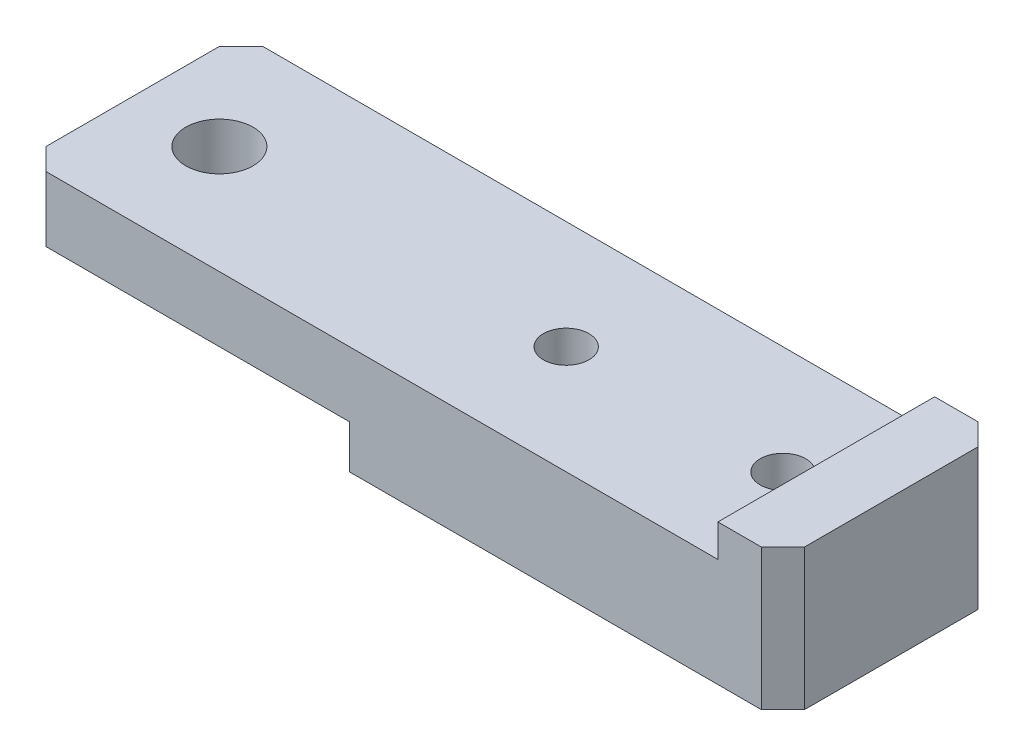
ISO-10303-21;
HEADER;
FILE_DESCRIPTION(('STEP AP214'),'2;1');
FILE_NAME('part.step','',(''),(''),'','','');
FILE_SCHEMA(('AUTOMOTIVE_DESIGN { 1 0 10303 214 1 1 1 1 }'));
ENDSEC;
DATA;
#1=APPLICATION_CONTEXT('core data for automotive mechanical design processes');
#2=APPLICATION_PROTOCOL_DEFINITION('international standard','automotive_design',2000,#1);
#3=PRODUCT_CONTEXT('',#1,'mechanical');
#4=PRODUCT('Part','Part','',(#3));
#5=PRODUCT_RELATED_PRODUCT_CATEGORY('part','',(#4));
#6=PRODUCT_DEFINITION_FORMATION('','',#4);
#7=PRODUCT_DEFINITION_CONTEXT('part definition',#1,'design');
#8=PRODUCT_DEFINITION('design','',#6,#7);
#9=PRODUCT_DEFINITION_SHAPE('','',#8);
#10=(LENGTH_UNIT() NAMED_UNIT(*) SI_UNIT(.MILLI.,.METRE.));
#11=(NAMED_UNIT(*) PLANE_ANGLE_UNIT() SI_UNIT($,.RADIAN.));
#12=(NAMED_UNIT(*) SI_UNIT($,.STERADIAN.) SOLID_ANGLE_UNIT());
#13=UNCERTAINTY_MEASURE_WITH_UNIT(LENGTH_MEASURE(1.E-05),#10,'distance_accuracy_value','');
#14=(GEOMETRIC_REPRESENTATION_CONTEXT(3) GLOBAL_UNCERTAINTY_ASSIGNED_CONTEXT((#13)) GLOBAL_UNIT_ASSIGNED_CONTEXT((#10,
#11,#12)) REPRESENTATION_CONTEXT('',''));
#15=CARTESIAN_POINT('',(0.,0.,0.));
#16=DIRECTION('',(0.,0.,1.));
#17=DIRECTION('',(1.,0.,0.));
#18=AXIS2_PLACEMENT_3D('',#15,#16,#17);
#19=CARTESIAN_POINT('',(64.,15.,10.));
#20=DIRECTION('',(1.,0.,0.));
#21=DIRECTION('',(0.,0.,-1.));
#22=AXIS2_PLACEMENT_3D('',#19,#20,#21);
#23=PLANE('',#22);
#24=DIRECTION('',(0.,-1.,0.));
#25=VECTOR('',#24,1.);
#26=CARTESIAN_POINT('',(64.,15.,-10.));
#27=LINE('',#26,#25);
#28=CARTESIAN_POINT('',(64.,15.,-10.));
#29=VERTEX_POINT('',#28);
#30=CARTESIAN_POINT('',(64.,12.,-10.));
#31=VERTEX_POINT('',#30);
#32=EDGE_CURVE('E163',#29,#31,#27,.T.);
#33=ORIENTED_EDGE('',*,*,#32,.T.);
#34=DIRECTION('',(0.,0.,-1.));
#35=VECTOR('',#34,1.);
#36=CARTESIAN_POINT('',(64.,12.,10.));
#37=LINE('',#36,#35);
#38=CARTESIAN_POINT('',(64.,12.,10.));
#39=VERTEX_POINT('',#38);
#40=EDGE_CURVE('E139',#39,#31,#37,.T.);
#41=ORIENTED_EDGE('',*,*,#40,.F.);
#42=DIRECTION('',(0.,-1.,0.));
#43=VECTOR('',#42,1.);
#44=CARTESIAN_POINT('',(64.,15.,10.));
#45=LINE('',#44,#43);
#46=CARTESIAN_POINT('',(64.,15.,10.));
#47=VERTEX_POINT('',#46);
#48=EDGE_CURVE('E149',#47,#39,#45,.T.);
#49=ORIENTED_EDGE('',*,*,#48,.F.);
#50=DIRECTION('',(0.,0.,-1.));
#51=VECTOR('',#50,1.);
#52=CARTESIAN_POINT('',(64.,15.,10.));
#53=LINE('',#52,#51);
#54=EDGE_CURVE('E286',#47,#29,#53,.T.);
#55=ORIENTED_EDGE('',*,*,#54,.T.);
#56=EDGE_LOOP('',(#33,#41,#49,#55));
#57=FACE_BOUND('',#56,.T.);
#58=ADVANCED_FACE('F40',(#57),#23,.F.);
#59=CARTESIAN_POINT('',(0.,12.,10.));
#60=DIRECTION('',(0.,-1.,0.));
#61=DIRECTION('',(0.,0.,-1.));
#62=AXIS2_PLACEMENT_3D('',#59,#60,#61);
#63=PLANE('',#62);
#64=CARTESIAN_POINT('',(8.,12.,0.));
#65=DIRECTION('',(0.,-1.,0.));
#66=DIRECTION('',(0.,0.,-1.));
#67=AXIS2_PLACEMENT_3D('',#64,#65,#66);
#68=CIRCLE('',#67,3.1);
#69=CARTESIAN_POINT('',(8.,12.,-3.1));
#70=VERTEX_POINT('',#69);
#71=EDGE_CURVE('E354',#70,#70,#68,.T.);
#72=ORIENTED_EDGE('',*,*,#71,.T.);
#73=EDGE_LOOP('',(#72));
#74=FACE_BOUND('',#73,.T.);
#75=CARTESIAN_POINT('',(60.,12.,0.));
#76=DIRECTION('',(0.,-1.,0.));
#77=DIRECTION('',(0.,0.,-1.));
#78=AXIS2_PLACEMENT_3D('',#75,#76,#77);
#79=CIRCLE('',#78,2.1);
#80=CARTESIAN_POINT('',(60.,12.,-2.1));
#81=VERTEX_POINT('',#80);
#82=EDGE_CURVE('E346',#81,#81,#79,.T.);
#83=ORIENTED_EDGE('',*,*,#82,.T.);
#84=EDGE_LOOP('',(#83));
#85=FACE_BOUND('',#84,.T.);
#86=CARTESIAN_POINT('',(40.,12.,0.));
#87=DIRECTION('',(0.,-1.,0.));
#88=DIRECTION('',(0.,0.,-1.));
#89=AXIS2_PLACEMENT_3D('',#86,#87,#88);
#90=CIRCLE('',#89,2.1);
#91=CARTESIAN_POINT('',(40.,12.,-2.1));
#92=VERTEX_POINT('',#91);
#93=EDGE_CURVE('E350',#92,#92,#90,.T.);
#94=ORIENTED_EDGE('',*,*,#93,.T.);
#95=EDGE_LOOP('',(#94));
#96=FACE_BOUND('',#95,.T.);
#97=DIRECTION('',(-1.,0.,0.));
#98=VECTOR('',#97,1.);
#99=CARTESIAN_POINT('',(0.,12.,-10.));
#100=LINE('',#99,#98);
#101=CARTESIAN_POINT('',(2.,12.,-10.));
#102=VERTEX_POINT('',#101);
#103=EDGE_CURVE('E299',#31,#102,#100,.T.);
#104=ORIENTED_EDGE('',*,*,#103,.T.);
#105=DIRECTION('',(0.707106781186549,0.,-0.707106781186546));
#106=VECTOR('',#105,1.);
#107=CARTESIAN_POINT('',(0.,12.,-8.00000000000001));
#108=LINE('',#107,#106);
#109=CARTESIAN_POINT('',(0.,12.,-8.00000000000001));
#110=VERTEX_POINT('',#109);
#111=EDGE_CURVE('E191',#102,#110,#108,.F.);
#112=ORIENTED_EDGE('',*,*,#111,.T.);
#113=DIRECTION('',(0.,0.,-1.));
#114=VECTOR('',#113,1.);
#115=CARTESIAN_POINT('',(0.,12.,10.));
#116=LINE('',#115,#114);
#117=CARTESIAN_POINT('',(0.,12.,8.));
#118=VERTEX_POINT('',#117);
#119=EDGE_CURVE('E166',#118,#110,#116,.T.);
#120=ORIENTED_EDGE('',*,*,#119,.F.);
#121=DIRECTION('',(0.707106781186546,0.,0.707106781186549));
#122=VECTOR('',#121,1.);
#123=CARTESIAN_POINT('',(1.99999999999999,12.,10.));
#124=LINE('',#123,#122);
#125=CARTESIAN_POINT('',(1.99999999999999,12.,10.));
#126=VERTEX_POINT('',#125);
#127=EDGE_CURVE('E143',#118,#126,#124,.T.);
#128=ORIENTED_EDGE('',*,*,#127,.T.);
#129=DIRECTION('',(-1.,0.,0.));
#130=VECTOR('',#129,1.);
#131=CARTESIAN_POINT('',(0.,12.,10.));
#132=LINE('',#131,#130);
#133=EDGE_CURVE('E134',#39,#126,#132,.T.);
#134=ORIENTED_EDGE('',*,*,#133,.F.);
#135=ORIENTED_EDGE('',*,*,#40,.T.);
#136=EDGE_LOOP('',(#104,#112,#120,#128,#134,#135));
#137=FACE_BOUND('',#136,.T.);
#138=ADVANCED_FACE('F137',(#74,#85,#96,#137),#63,.F.);
#139=CARTESIAN_POINT('',(0.,6.,10.));
#140=DIRECTION('',(1.,0.,0.));
#141=DIRECTION('',(0.,1.,0.));
#142=AXIS2_PLACEMENT_3D('',#139,#140,#141);
#143=PLANE('',#142);
#144=ORIENTED_EDGE('',*,*,#119,.T.);
#145=DIRECTION('',(0.,-1.,0.));
#146=VECTOR('',#145,1.);
#147=CARTESIAN_POINT('',(0.,6.,-8.00000000000001));
#148=LINE('',#147,#146);
#149=CARTESIAN_POINT('',(0.,6.,-8.00000000000001));
#150=VERTEX_POINT('',#149);
#151=EDGE_CURVE('E170',#110,#150,#148,.T.);
#152=ORIENTED_EDGE('',*,*,#151,.T.);
#153=DIRECTION('',(0.,0.,-1.));
#154=VECTOR('',#153,1.);
#155=CARTESIAN_POINT('',(0.,6.,10.));
#156=LINE('',#155,#154);
#157=CARTESIAN_POINT('',(0.,6.,8.));
#158=VERTEX_POINT('',#157);
#159=EDGE_CURVE('E173',#158,#150,#156,.T.);
#160=ORIENTED_EDGE('',*,*,#159,.F.);
#161=DIRECTION('',(0.,1.,0.));
#162=VECTOR('',#161,1.);
#163=CARTESIAN_POINT('',(0.,12.,8.));
#164=LINE('',#163,#162);
#165=EDGE_CURVE('E165',#158,#118,#164,.T.);
#166=ORIENTED_EDGE('',*,*,#165,.T.);
#167=EDGE_LOOP('',(#144,#152,#160,#166));
#168=FACE_BOUND('',#167,.T.);
#169=ADVANCED_FACE('F241',(#168),#143,.F.);
#170=CARTESIAN_POINT('',(0.,6.,10.));
#171=DIRECTION('',(0.,1.,0.));
#172=DIRECTION('',(0.,0.,1.));
#173=AXIS2_PLACEMENT_3D('',#170,#171,#172);
#174=PLANE('',#173);
#175=CARTESIAN_POINT('',(8.,6.,0.));
#176=DIRECTION('',(0.,1.,0.));
#177=DIRECTION('',(0.,0.,1.));
#178=AXIS2_PLACEMENT_3D('',#175,#176,#177);
#179=CIRCLE('',#178,6.);
#180=CARTESIAN_POINT('',(8.,6.,6.));
#181=VERTEX_POINT('',#180);
#182=EDGE_CURVE('E11',#181,#181,#179,.T.);
#183=ORIENTED_EDGE('',*,*,#182,.T.);
#184=EDGE_LOOP('',(#183));
#185=FACE_BOUND('',#184,.T.);
#186=ORIENTED_EDGE('',*,*,#159,.T.);
#187=DIRECTION('',(-0.707106781186549,0.,0.707106781186546));
#188=VECTOR('',#187,1.);
#189=CARTESIAN_POINT('',(0.,6.,-8.00000000000001));
#190=LINE('',#189,#188);
#191=CARTESIAN_POINT('',(2.,6.,-10.));
#192=VERTEX_POINT('',#191);
#193=EDGE_CURVE('E183',#150,#192,#190,.F.);
#194=ORIENTED_EDGE('',*,*,#193,.T.);
#195=DIRECTION('',(1.,0.,0.));
#196=VECTOR('',#195,1.);
#197=CARTESIAN_POINT('',(0.,6.,-10.));
#198=LINE('',#197,#196);
#199=CARTESIAN_POINT('',(30.,6.,-10.));
#200=VERTEX_POINT('',#199);
#201=EDGE_CURVE('E303',#192,#200,#198,.T.);
#202=ORIENTED_EDGE('',*,*,#201,.T.);
#203=DIRECTION('',(0.,0.,-1.));
#204=VECTOR('',#203,1.);
#205=CARTESIAN_POINT('',(30.,6.,10.));
#206=LINE('',#205,#204);
#207=CARTESIAN_POINT('',(30.,6.,10.));
#208=VERTEX_POINT('',#207);
#209=EDGE_CURVE('E324',#208,#200,#206,.T.);
#210=ORIENTED_EDGE('',*,*,#209,.F.);
#211=DIRECTION('',(1.,0.,0.));
#212=VECTOR('',#211,1.);
#213=CARTESIAN_POINT('',(0.,6.,10.));
#214=LINE('',#213,#212);
#215=CARTESIAN_POINT('',(1.99999999999999,6.,10.));
#216=VERTEX_POINT('',#215);
#217=EDGE_CURVE('E148',#216,#208,#214,.T.);
#218=ORIENTED_EDGE('',*,*,#217,.F.);
#219=DIRECTION('',(-0.707106781186546,0.,-0.707106781186549));
#220=VECTOR('',#219,1.);
#221=CARTESIAN_POINT('',(1.99999999999999,6.,10.));
#222=LINE('',#221,#220);
#223=EDGE_CURVE('E180',#216,#158,#222,.T.);
#224=ORIENTED_EDGE('',*,*,#223,.T.);
#225=EDGE_LOOP('',(#186,#194,#202,#210,#218,#224));
#226=FACE_BOUND('',#225,.T.);
#227=ADVANCED_FACE('F331',(#185,#226),#174,.F.);
#228=CARTESIAN_POINT('',(30.,6.,10.));
#229=DIRECTION('',(1.,0.,0.));
#230=DIRECTION('',(0.,0.,-1.));
#231=AXIS2_PLACEMENT_3D('',#228,#229,#230);
#232=PLANE('',#231);
#233=DIRECTION('',(0.,-1.,0.));
#234=VECTOR('',#233,1.);
#235=CARTESIAN_POINT('',(30.,6.,-10.));
#236=LINE('',#235,#234);
#237=CARTESIAN_POINT('',(30.,2.,-10.));
#238=VERTEX_POINT('',#237);
#239=EDGE_CURVE('E306',#200,#238,#236,.T.);
#240=ORIENTED_EDGE('',*,*,#239,.T.);
#241=DIRECTION('',(0.,0.,-1.));
#242=VECTOR('',#241,1.);
#243=CARTESIAN_POINT('',(30.,2.,10.));
#244=LINE('',#243,#242);
#245=CARTESIAN_POINT('',(30.,2.,10.));
#246=VERTEX_POINT('',#245);
#247=EDGE_CURVE('E320',#246,#238,#244,.T.);
#248=ORIENTED_EDGE('',*,*,#247,.F.);
#249=DIRECTION('',(0.,-1.,0.));
#250=VECTOR('',#249,1.);
#251=CARTESIAN_POINT('',(30.,6.,10.));
#252=LINE('',#251,#250);
#253=EDGE_CURVE('E293',#208,#246,#252,.T.);
#254=ORIENTED_EDGE('',*,*,#253,.F.);
#255=ORIENTED_EDGE('',*,*,#209,.T.);
#256=EDGE_LOOP('',(#240,#248,#254,#255));
#257=FACE_BOUND('',#256,.T.);
#258=ADVANCED_FACE('F376',(#257),#232,.F.);
#259=CARTESIAN_POINT('',(70.,2.,10.));
#260=DIRECTION('',(0.,1.,0.));
#261=DIRECTION('',(-1.,0.,0.));
#262=AXIS2_PLACEMENT_3D('',#259,#260,#261);
#263=PLANE('',#262);
#264=CARTESIAN_POINT('',(60.,2.,0.));
#265=DIRECTION('',(0.,-1.,0.));
#266=DIRECTION('',(1.,0.,0.));
#267=AXIS2_PLACEMENT_3D('',#264,#265,#266);
#268=CIRCLE('',#267,2.1);
#269=CARTESIAN_POINT('',(62.1,2.,0.));
#270=VERTEX_POINT('',#269);
#271=EDGE_CURVE('E362',#270,#270,#268,.T.);
#272=ORIENTED_EDGE('',*,*,#271,.F.);
#273=EDGE_LOOP('',(#272));
#274=FACE_BOUND('',#273,.T.);
#275=CARTESIAN_POINT('',(40.,2.,0.));
#276=DIRECTION('',(0.,-1.,0.));
#277=DIRECTION('',(1.,0.,0.));
#278=AXIS2_PLACEMENT_3D('',#275,#276,#277);
#279=CIRCLE('',#278,2.1);
#280=CARTESIAN_POINT('',(42.1,2.,0.));
#281=VERTEX_POINT('',#280);
#282=EDGE_CURVE('E358',#281,#281,#279,.T.);
#283=ORIENTED_EDGE('',*,*,#282,.F.);
#284=EDGE_LOOP('',(#283));
#285=FACE_BOUND('',#284,.T.);
#286=DIRECTION('',(1.,0.,0.));
#287=VECTOR('',#286,1.);
#288=CARTESIAN_POINT('',(70.,2.,-10.));
#289=LINE('',#288,#287);
#290=CARTESIAN_POINT('',(68.,2.,-10.));
#291=VERTEX_POINT('',#290);
#292=EDGE_CURVE('E309',#238,#291,#289,.T.);
#293=ORIENTED_EDGE('',*,*,#292,.T.);
#294=DIRECTION('',(-0.707106781186549,0.,-0.707106781186546));
#295=VECTOR('',#294,1.);
#296=CARTESIAN_POINT('',(70.,2.,-8.00000000000001));
#297=LINE('',#296,#295);
#298=CARTESIAN_POINT('',(70.,2.,-8.00000000000001));
#299=VERTEX_POINT('',#298);
#300=EDGE_CURVE('E214',#291,#299,#297,.F.);
#301=ORIENTED_EDGE('',*,*,#300,.T.);
#302=DIRECTION('',(0.,0.,-1.));
#303=VECTOR('',#302,1.);
#304=CARTESIAN_POINT('',(70.,2.,10.));
#305=LINE('',#304,#303);
#306=CARTESIAN_POINT('',(70.,2.,7.99999999999999));
#307=VERTEX_POINT('',#306);
#308=EDGE_CURVE('E316',#307,#299,#305,.T.);
#309=ORIENTED_EDGE('',*,*,#308,.F.);
#310=DIRECTION('',(-0.707106781186544,0.,0.707106781186551));
#311=VECTOR('',#310,1.);
#312=CARTESIAN_POINT('',(68.,2.,10.));
#313=LINE('',#312,#311);
#314=CARTESIAN_POINT('',(68.,2.,10.));
#315=VERTEX_POINT('',#314);
#316=EDGE_CURVE('E56',#307,#315,#313,.T.);
#317=ORIENTED_EDGE('',*,*,#316,.T.);
#318=DIRECTION('',(1.,0.,0.));
#319=VECTOR('',#318,1.);
#320=CARTESIAN_POINT('',(70.,2.,10.));
#321=LINE('',#320,#319);
#322=EDGE_CURVE('E281',#246,#315,#321,.T.);
#323=ORIENTED_EDGE('',*,*,#322,.F.);
#324=ORIENTED_EDGE('',*,*,#247,.T.);
#325=EDGE_LOOP('',(#293,#301,#309,#317,#323,#324));
#326=FACE_BOUND('',#325,.T.);
#327=ADVANCED_FACE('F372',(#274,#285,#326),#263,.F.);
#328=CARTESIAN_POINT('',(70.,15.,10.));
#329=DIRECTION('',(-1.,0.,0.));
#330=DIRECTION('',(0.,0.,1.));
#331=AXIS2_PLACEMENT_3D('',#328,#329,#330);
#332=PLANE('',#331);
#333=ORIENTED_EDGE('',*,*,#308,.T.);
#334=DIRECTION('',(0.,1.,0.));
#335=VECTOR('',#334,1.);
#336=CARTESIAN_POINT('',(70.,15.,-8.00000000000001));
#337=LINE('',#336,#335);
#338=CARTESIAN_POINT('',(70.,15.,-8.00000000000001));
#339=VERTEX_POINT('',#338);
#340=EDGE_CURVE('E200',#299,#339,#337,.T.);
#341=ORIENTED_EDGE('',*,*,#340,.T.);
#342=DIRECTION('',(0.,0.,-1.));
#343=VECTOR('',#342,1.);
#344=CARTESIAN_POINT('',(70.,15.,10.));
#345=LINE('',#344,#343);
#346=CARTESIAN_POINT('',(70.,15.,7.99999999999999));
#347=VERTEX_POINT('',#346);
#348=EDGE_CURVE('E291',#347,#339,#345,.T.);
#349=ORIENTED_EDGE('',*,*,#348,.F.);
#350=DIRECTION('',(0.,-1.,0.));
#351=VECTOR('',#350,1.);
#352=CARTESIAN_POINT('',(70.,2.,7.99999999999999));
#353=LINE('',#352,#351);
#354=EDGE_CURVE('E197',#347,#307,#353,.T.);
#355=ORIENTED_EDGE('',*,*,#354,.T.);
#356=EDGE_LOOP('',(#333,#341,#349,#355));
#357=FACE_BOUND('',#356,.T.);
#358=ADVANCED_FACE('F375',(#357),#332,.F.);
#359=CARTESIAN_POINT('',(70.,15.,10.));
#360=DIRECTION('',(0.,-1.,0.));
#361=DIRECTION('',(0.,0.,-1.));
#362=AXIS2_PLACEMENT_3D('',#359,#360,#361);
#363=PLANE('',#362);
#364=ORIENTED_EDGE('',*,*,#348,.T.);
#365=DIRECTION('',(0.707106781186549,0.,0.707106781186546));
#366=VECTOR('',#365,1.);
#367=CARTESIAN_POINT('',(70.,15.,-8.00000000000001));
#368=LINE('',#367,#366);
#369=CARTESIAN_POINT('',(68.,15.,-10.));
#370=VERTEX_POINT('',#369);
#371=EDGE_CURVE('E207',#339,#370,#368,.F.);
#372=ORIENTED_EDGE('',*,*,#371,.T.);
#373=DIRECTION('',(-1.,0.,0.));
#374=VECTOR('',#373,1.);
#375=CARTESIAN_POINT('',(70.,15.,-10.));
#376=LINE('',#375,#374);
#377=EDGE_CURVE('E160',#370,#29,#376,.T.);
#378=ORIENTED_EDGE('',*,*,#377,.T.);
#379=ORIENTED_EDGE('',*,*,#54,.F.);
#380=DIRECTION('',(-1.,0.,0.));
#381=VECTOR('',#380,1.);
#382=CARTESIAN_POINT('',(70.,15.,10.));
#383=LINE('',#382,#381);
#384=CARTESIAN_POINT('',(68.,15.,10.));
#385=VERTEX_POINT('',#384);
#386=EDGE_CURVE('E155',#385,#47,#383,.T.);
#387=ORIENTED_EDGE('',*,*,#386,.F.);
#388=DIRECTION('',(0.707106781186544,0.,-0.707106781186551));
#389=VECTOR('',#388,1.);
#390=CARTESIAN_POINT('',(68.,15.,10.));
#391=LINE('',#390,#389);
#392=EDGE_CURVE('E204',#385,#347,#391,.T.);
#393=ORIENTED_EDGE('',*,*,#392,.T.);
#394=EDGE_LOOP('',(#364,#372,#378,#379,#387,#393));
#395=FACE_BOUND('',#394,.T.);
#396=ADVANCED_FACE('F284',(#395),#363,.F.);
#397=CARTESIAN_POINT('',(0.,0.,10.));
#398=DIRECTION('',(0.,0.,1.));
#399=DIRECTION('',(1.,0.,0.));
#400=AXIS2_PLACEMENT_3D('',#397,#398,#399);
#401=PLANE('',#400);
#402=ORIENTED_EDGE('',*,*,#322,.T.);
#403=DIRECTION('',(0.,1.,0.));
#404=VECTOR('',#403,1.);
#405=CARTESIAN_POINT('',(68.,15.,10.));
#406=LINE('',#405,#404);
#407=EDGE_CURVE('E217',#315,#385,#406,.T.);
#408=ORIENTED_EDGE('',*,*,#407,.T.);
#409=ORIENTED_EDGE('',*,*,#386,.T.);
#410=ORIENTED_EDGE('',*,*,#48,.T.);
#411=ORIENTED_EDGE('',*,*,#133,.T.);
#412=DIRECTION('',(0.,-1.,0.));
#413=VECTOR('',#412,1.);
#414=CARTESIAN_POINT('',(1.99999999999999,6.,10.));
#415=LINE('',#414,#413);
#416=EDGE_CURVE('E194',#126,#216,#415,.T.);
#417=ORIENTED_EDGE('',*,*,#416,.T.);
#418=ORIENTED_EDGE('',*,*,#217,.T.);
#419=ORIENTED_EDGE('',*,*,#253,.T.);
#420=EDGE_LOOP('',(#402,#408,#409,#410,#411,#417,#418,#419));
#421=FACE_BOUND('',#420,.T.);
#422=ADVANCED_FACE('F152',(#421),#401,.T.);
#423=CARTESIAN_POINT('',(0.,0.,-10.));
#424=DIRECTION('',(0.,0.,1.));
#425=DIRECTION('',(1.,0.,0.));
#426=AXIS2_PLACEMENT_3D('',#423,#424,#425);
#427=PLANE('',#426);
#428=ORIENTED_EDGE('',*,*,#377,.F.);
#429=DIRECTION('',(0.,-1.,0.));
#430=VECTOR('',#429,1.);
#431=CARTESIAN_POINT('',(68.,0.,-10.));
#432=LINE('',#431,#430);
#433=EDGE_CURVE('E64',#370,#291,#432,.T.);
#434=ORIENTED_EDGE('',*,*,#433,.T.);
#435=ORIENTED_EDGE('',*,*,#292,.F.);
#436=ORIENTED_EDGE('',*,*,#239,.F.);
#437=ORIENTED_EDGE('',*,*,#201,.F.);
#438=DIRECTION('',(0.,1.,0.));
#439=VECTOR('',#438,1.);
#440=CARTESIAN_POINT('',(2.,0.,-10.));
#441=LINE('',#440,#439);
#442=EDGE_CURVE('E186',#192,#102,#441,.T.);
#443=ORIENTED_EDGE('',*,*,#442,.T.);
#444=ORIENTED_EDGE('',*,*,#103,.F.);
#445=ORIENTED_EDGE('',*,*,#32,.F.);
#446=EDGE_LOOP('',(#428,#434,#435,#436,#437,#443,#444,#445));
#447=FACE_BOUND('',#446,.T.);
#448=ADVANCED_FACE('F384',(#447),#427,.F.);
#449=CARTESIAN_POINT('',(8.,2.,0.));
#450=DIRECTION('',(0.,1.,0.));
#451=DIRECTION('',(0.,0.,1.));
#452=AXIS2_PLACEMENT_3D('',#449,#450,#451);
#453=CYLINDRICAL_SURFACE('',#452,5.);
#454=CARTESIAN_POINT('',(8.,5.,0.));
#455=DIRECTION('',(0.,1.,0.));
#456=DIRECTION('',(0.,0.,1.));
#457=AXIS2_PLACEMENT_3D('',#454,#455,#456);
#458=CIRCLE('',#457,5.);
#459=CARTESIAN_POINT('',(8.,5.,5.));
#460=VERTEX_POINT('',#459);
#461=EDGE_CURVE('E49',#460,#460,#458,.F.);
#462=ORIENTED_EDGE('',*,*,#461,.T.);
#463=EDGE_LOOP('',(#462));
#464=FACE_BOUND('',#463,.T.);
#465=CARTESIAN_POINT('',(8.,2.,0.));
#466=DIRECTION('',(0.,-1.,0.));
#467=DIRECTION('',(0.,0.,-1.));
#468=AXIS2_PLACEMENT_3D('',#465,#466,#467);
#469=CIRCLE('',#468,5.);
#470=CARTESIAN_POINT('',(8.,2.,-5.));
#471=VERTEX_POINT('',#470);
#472=EDGE_CURVE('E300',#471,#471,#469,.T.);
#473=ORIENTED_EDGE('',*,*,#472,.F.);
#474=EDGE_LOOP('',(#473));
#475=FACE_BOUND('',#474,.T.);
#476=ADVANCED_FACE('F223',(#464,#475),#453,.T.);
#477=CARTESIAN_POINT('',(8.,2.,0.));
#478=DIRECTION('',(0.,-1.,0.));
#479=DIRECTION('',(0.,0.,-1.));
#480=AXIS2_PLACEMENT_3D('',#477,#478,#479);
#481=PLANE('',#480);
#482=CARTESIAN_POINT('',(8.,1.99999999999999,0.));
#483=DIRECTION('',(0.,-1.,0.));
#484=DIRECTION('',(1.,0.,0.));
#485=AXIS2_PLACEMENT_3D('',#482,#483,#484);
#486=CIRCLE('',#485,3.1);
#487=CARTESIAN_POINT('',(11.1,1.99999999999999,0.));
#488=VERTEX_POINT('',#487);
#489=EDGE_CURVE('E363',#488,#488,#486,.T.);
#490=ORIENTED_EDGE('',*,*,#489,.F.);
#491=EDGE_LOOP('',(#490));
#492=FACE_BOUND('',#491,.T.);
#493=ORIENTED_EDGE('',*,*,#472,.T.);
#494=EDGE_LOOP('',(#493));
#495=FACE_BOUND('',#494,.T.);
#496=ADVANCED_FACE('F254',(#492,#495),#481,.T.);
#497=CARTESIAN_POINT('',(0.,6.,-8.00000000000001));
#498=DIRECTION('',(0.707106781186546,0.,0.707106781186549));
#499=DIRECTION('',(0.,-1.,0.));
#500=AXIS2_PLACEMENT_3D('',#497,#498,#499);
#501=PLANE('',#500);
#502=ORIENTED_EDGE('',*,*,#111,.F.);
#503=ORIENTED_EDGE('',*,*,#442,.F.);
#504=ORIENTED_EDGE('',*,*,#193,.F.);
#505=ORIENTED_EDGE('',*,*,#151,.F.);
#506=EDGE_LOOP('',(#502,#503,#504,#505));
#507=FACE_BOUND('',#506,.T.);
#508=ADVANCED_FACE('F247',(#507),#501,.F.);
#509=CARTESIAN_POINT('',(1.99999999999999,0.,10.));
#510=DIRECTION('',(-0.707106781186549,0.,0.707106781186546));
#511=DIRECTION('',(0.,1.,0.));
#512=AXIS2_PLACEMENT_3D('',#509,#510,#511);
#513=PLANE('',#512);
#514=ORIENTED_EDGE('',*,*,#127,.F.);
#515=ORIENTED_EDGE('',*,*,#165,.F.);
#516=ORIENTED_EDGE('',*,*,#223,.F.);
#517=ORIENTED_EDGE('',*,*,#416,.F.);
#518=EDGE_LOOP('',(#514,#515,#516,#517));
#519=FACE_BOUND('',#518,.T.);
#520=ADVANCED_FACE('F253',(#519),#513,.T.);
#521=CARTESIAN_POINT('',(70.,15.,-8.00000000000001));
#522=DIRECTION('',(-0.707106781186546,0.,0.707106781186549));
#523=DIRECTION('',(0.,1.,0.));
#524=AXIS2_PLACEMENT_3D('',#521,#522,#523);
#525=PLANE('',#524);
#526=ORIENTED_EDGE('',*,*,#300,.F.);
#527=ORIENTED_EDGE('',*,*,#433,.F.);
#528=ORIENTED_EDGE('',*,*,#371,.F.);
#529=ORIENTED_EDGE('',*,*,#340,.F.);
#530=EDGE_LOOP('',(#526,#527,#528,#529));
#531=FACE_BOUND('',#530,.T.);
#532=ADVANCED_FACE('F261',(#531),#525,.F.);
#533=CARTESIAN_POINT('',(68.,0.,10.));
#534=DIRECTION('',(0.707106781186551,0.,0.707106781186544));
#535=DIRECTION('',(0.,-1.,0.));
#536=AXIS2_PLACEMENT_3D('',#533,#534,#535);
#537=PLANE('',#536);
#538=ORIENTED_EDGE('',*,*,#316,.F.);
#539=ORIENTED_EDGE('',*,*,#354,.F.);
#540=ORIENTED_EDGE('',*,*,#392,.F.);
#541=ORIENTED_EDGE('',*,*,#407,.F.);
#542=EDGE_LOOP('',(#538,#539,#540,#541));
#543=FACE_BOUND('',#542,.T.);
#544=ADVANCED_FACE('F267',(#543),#537,.T.);
#545=CARTESIAN_POINT('',(8.,15.,0.));
#546=DIRECTION('',(0.,-1.,0.));
#547=DIRECTION('',(1.,0.,0.));
#548=AXIS2_PLACEMENT_3D('',#545,#546,#547);
#549=CYLINDRICAL_SURFACE('',#548,3.1);
#550=ORIENTED_EDGE('',*,*,#489,.T.);
#551=EDGE_LOOP('',(#550));
#552=FACE_BOUND('',#551,.T.);
#553=ORIENTED_EDGE('',*,*,#71,.F.);
#554=EDGE_LOOP('',(#553));
#555=FACE_BOUND('',#554,.T.);
#556=ADVANCED_FACE('F272',(#552,#555),#549,.F.);
#557=CARTESIAN_POINT('',(40.,15.,0.));
#558=DIRECTION('',(0.,-1.,0.));
#559=DIRECTION('',(1.,0.,0.));
#560=AXIS2_PLACEMENT_3D('',#557,#558,#559);
#561=CYLINDRICAL_SURFACE('',#560,2.1);
#562=ORIENTED_EDGE('',*,*,#282,.T.);
#563=EDGE_LOOP('',(#562));
#564=FACE_BOUND('',#563,.T.);
#565=ORIENTED_EDGE('',*,*,#93,.F.);
#566=EDGE_LOOP('',(#565));
#567=FACE_BOUND('',#566,.T.);
#568=ADVANCED_FACE('F232',(#564,#567),#561,.F.);
#569=CARTESIAN_POINT('',(60.,15.,0.));
#570=DIRECTION('',(0.,-1.,0.));
#571=DIRECTION('',(1.,0.,0.));
#572=AXIS2_PLACEMENT_3D('',#569,#570,#571);
#573=CYLINDRICAL_SURFACE('',#572,2.1);
#574=ORIENTED_EDGE('',*,*,#271,.T.);
#575=EDGE_LOOP('',(#574));
#576=FACE_BOUND('',#575,.T.);
#577=ORIENTED_EDGE('',*,*,#82,.F.);
#578=EDGE_LOOP('',(#577));
#579=FACE_BOUND('',#578,.T.);
#580=ADVANCED_FACE('F227',(#576,#579),#573,.F.);
#581=CARTESIAN_POINT('',(8.,5.,0.));
#582=DIRECTION('',(0.,1.,0.));
#583=DIRECTION('',(0.,0.,1.));
#584=AXIS2_PLACEMENT_3D('',#581,#582,#583);
#585=TOROIDAL_SURFACE('',#584,6.,1.);
#586=ORIENTED_EDGE('',*,*,#182,.F.);
#587=EDGE_LOOP('',(#586));
#588=FACE_BOUND('',#587,.T.);
#589=ORIENTED_EDGE('',*,*,#461,.F.);
#590=EDGE_LOOP('',(#589));
#591=FACE_BOUND('',#590,.T.);
#592=ADVANCED_FACE('F42',(#588,#591),#585,.F.);
#593=CLOSED_SHELL('',(#58,#138,#169,#227,#258,#327,#358,#396,#422,#448,#476,#496,#508,#520,#532,
#544,#556,#568,#580,#592));
#594=MANIFOLD_SOLID_BREP('B2',#593);
#595=ADVANCED_BREP_SHAPE_REPRESENTATION('',(#18,#594),#14);
#596=SHAPE_DEFINITION_REPRESENTATION(#9,#595);
ENDSEC;
END-ISO-10303-21;
